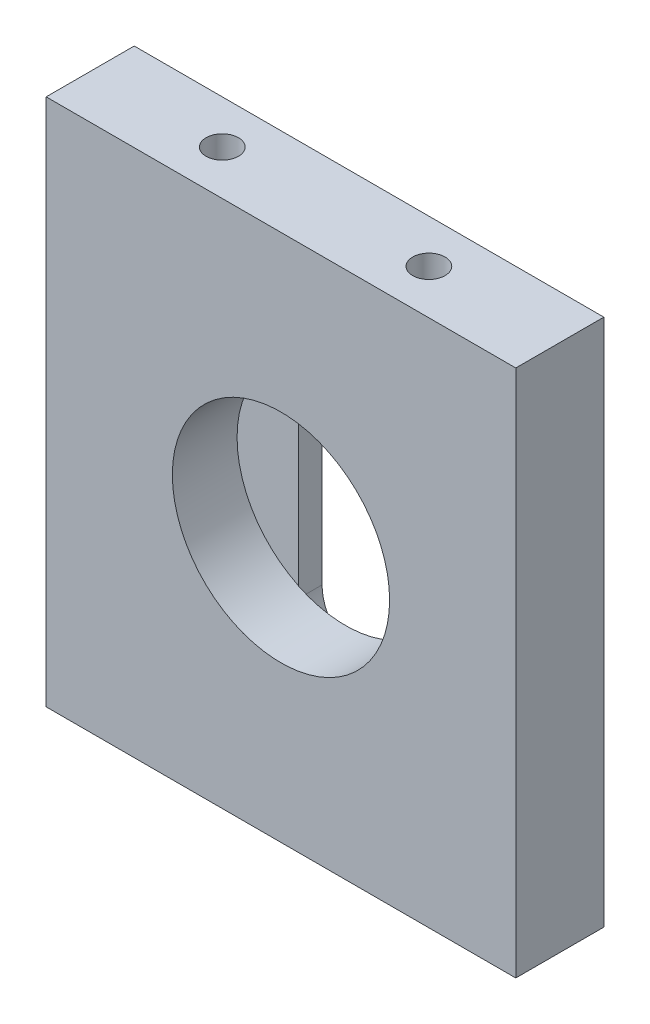
ISO-10303-21;
HEADER;
FILE_DESCRIPTION(('STEP AP214'),'2;1');
FILE_NAME('part.step','',(''),(''),'','','');
FILE_SCHEMA(('AUTOMOTIVE_DESIGN { 1 0 10303 214 1 1 1 1 }'));
ENDSEC;
DATA;
#1=APPLICATION_CONTEXT('core data for automotive mechanical design processes');
#2=APPLICATION_PROTOCOL_DEFINITION('international standard','automotive_design',2000,#1);
#3=PRODUCT_CONTEXT('',#1,'mechanical');
#4=PRODUCT('Part','Part','',(#3));
#5=PRODUCT_RELATED_PRODUCT_CATEGORY('part','',(#4));
#6=PRODUCT_DEFINITION_FORMATION('','',#4);
#7=PRODUCT_DEFINITION_CONTEXT('part definition',#1,'design');
#8=PRODUCT_DEFINITION('design','',#6,#7);
#9=PRODUCT_DEFINITION_SHAPE('','',#8);
#10=(LENGTH_UNIT() NAMED_UNIT(*) SI_UNIT(.MILLI.,.METRE.));
#11=(NAMED_UNIT(*) PLANE_ANGLE_UNIT() SI_UNIT($,.RADIAN.));
#12=(NAMED_UNIT(*) SI_UNIT($,.STERADIAN.) SOLID_ANGLE_UNIT());
#13=UNCERTAINTY_MEASURE_WITH_UNIT(LENGTH_MEASURE(1.E-05),#10,'distance_accuracy_value','');
#14=(GEOMETRIC_REPRESENTATION_CONTEXT(3) GLOBAL_UNCERTAINTY_ASSIGNED_CONTEXT((#13)) GLOBAL_UNIT_ASSIGNED_CONTEXT((#10,
#11,#12)) REPRESENTATION_CONTEXT('',''));
#15=CARTESIAN_POINT('',(0.,0.,0.));
#16=DIRECTION('',(0.,0.,1.));
#17=DIRECTION('',(1.,0.,0.));
#18=AXIS2_PLACEMENT_3D('',#15,#16,#17);
#19=CARTESIAN_POINT('',(-50.8,57.15,5.05000006));
#20=DIRECTION('',(0.,0.,1.));
#21=DIRECTION('',(1.,0.,0.));
#22=AXIS2_PLACEMENT_3D('',#19,#20,#21);
#23=PLANE('',#22);
#24=DIRECTION('',(0.,1.,0.));
#25=VECTOR('',#24,1.);
#26=CARTESIAN_POINT('',(-40.64,57.15,5.05000006));
#27=LINE('',#26,#25);
#28=CARTESIAN_POINT('',(-40.64,35.9597999395944,5.05000006));
#29=VERTEX_POINT('',#28);
#30=CARTESIAN_POINT('',(-40.64,78.3402000604056,5.05000006));
#31=VERTEX_POINT('',#30);
#32=EDGE_CURVE('E1775',#29,#31,#27,.T.);
#33=ORIENTED_EDGE('',*,*,#32,.F.);
#34=CARTESIAN_POINT('',(-50.8,57.15,5.05000006));
#35=DIRECTION('',(0.,0.,1.));
#36=DIRECTION('',(1.,0.,0.));
#37=AXIS2_PLACEMENT_3D('',#34,#35,#36);
#38=CIRCLE('',#37,23.5000038);
#39=EDGE_CURVE('E1689',#29,#31,#38,.T.);
#40=ORIENTED_EDGE('',*,*,#39,.T.);
#41=EDGE_LOOP('',(#33,#40));
#42=FACE_BOUND('',#41,.T.);
#43=ADVANCED_FACE('F1516',(#42),#23,.T.);
#44=CARTESIAN_POINT('',(0.,0.,19.05));
#45=DIRECTION('',(0.,1.,0.));
#46=DIRECTION('',(0.,0.,1.));
#47=AXIS2_PLACEMENT_3D('',#44,#45,#46);
#48=PLANE('',#47);
#49=CARTESIAN_POINT('',(-73.152,0.,9.652));
#50=DIRECTION('',(0.,-1.,0.));
#51=DIRECTION('',(0.,0.,-1.));
#52=AXIS2_PLACEMENT_3D('',#49,#50,#51);
#53=CIRCLE('',#52,3.5);
#54=CARTESIAN_POINT('',(-73.152,0.,6.152));
#55=VERTEX_POINT('',#54);
#56=EDGE_CURVE('E1711',#55,#55,#53,.T.);
#57=ORIENTED_EDGE('',*,*,#56,.F.);
#58=EDGE_LOOP('',(#57));
#59=FACE_BOUND('',#58,.T.);
#60=CARTESIAN_POINT('',(-28.448,0.,9.652));
#61=DIRECTION('',(0.,-1.,0.));
#62=DIRECTION('',(0.,0.,-1.));
#63=AXIS2_PLACEMENT_3D('',#60,#61,#62);
#64=CIRCLE('',#63,3.5);
#65=CARTESIAN_POINT('',(-28.448,0.,6.152));
#66=VERTEX_POINT('',#65);
#67=EDGE_CURVE('E1722',#66,#66,#64,.T.);
#68=ORIENTED_EDGE('',*,*,#67,.F.);
#69=EDGE_LOOP('',(#68));
#70=FACE_BOUND('',#69,.T.);
#71=DIRECTION('',(1.,0.,0.));
#72=VECTOR('',#71,1.);
#73=CARTESIAN_POINT('',(0.,0.,0.));
#74=LINE('',#73,#72);
#75=CARTESIAN_POINT('',(-101.6,0.,0.));
#76=VERTEX_POINT('',#75);
#77=CARTESIAN_POINT('',(0.,0.,0.));
#78=VERTEX_POINT('',#77);
#79=EDGE_CURVE('E1727',#76,#78,#74,.T.);
#80=ORIENTED_EDGE('',*,*,#79,.T.);
#81=DIRECTION('',(0.,0.,-1.));
#82=VECTOR('',#81,1.);
#83=CARTESIAN_POINT('',(0.,0.,19.05));
#84=LINE('',#83,#82);
#85=CARTESIAN_POINT('',(0.,0.,19.05));
#86=VERTEX_POINT('',#85);
#87=EDGE_CURVE('E1770',#86,#78,#84,.T.);
#88=ORIENTED_EDGE('',*,*,#87,.F.);
#89=DIRECTION('',(1.,0.,0.));
#90=VECTOR('',#89,1.);
#91=CARTESIAN_POINT('',(0.,0.,19.05));
#92=LINE('',#91,#90);
#93=CARTESIAN_POINT('',(-101.6,0.,19.05));
#94=VERTEX_POINT('',#93);
#95=EDGE_CURVE('E1729',#94,#86,#92,.T.);
#96=ORIENTED_EDGE('',*,*,#95,.F.);
#97=DIRECTION('',(0.,0.,-1.));
#98=VECTOR('',#97,1.);
#99=CARTESIAN_POINT('',(-101.6,0.,19.05));
#100=LINE('',#99,#98);
#101=EDGE_CURVE('E1744',#94,#76,#100,.T.);
#102=ORIENTED_EDGE('',*,*,#101,.T.);
#103=EDGE_LOOP('',(#80,#88,#96,#102));
#104=FACE_BOUND('',#103,.T.);
#105=ADVANCED_FACE('F1519',(#59,#70,#104),#48,.F.);
#106=CARTESIAN_POINT('',(0.,0.,19.05));
#107=DIRECTION('',(-1.,0.,0.));
#108=DIRECTION('',(0.,0.,1.));
#109=AXIS2_PLACEMENT_3D('',#106,#107,#108);
#110=PLANE('',#109);
#111=DIRECTION('',(0.,1.,0.));
#112=VECTOR('',#111,1.);
#113=CARTESIAN_POINT('',(0.,0.,0.));
#114=LINE('',#113,#112);
#115=CARTESIAN_POINT('',(0.,114.3,0.));
#116=VERTEX_POINT('',#115);
#117=EDGE_CURVE('E1748',#78,#116,#114,.T.);
#118=ORIENTED_EDGE('',*,*,#117,.T.);
#119=DIRECTION('',(0.,0.,-1.));
#120=VECTOR('',#119,1.);
#121=CARTESIAN_POINT('',(0.,114.3,19.05));
#122=LINE('',#121,#120);
#123=CARTESIAN_POINT('',(0.,114.3,19.05));
#124=VERTEX_POINT('',#123);
#125=EDGE_CURVE('E1764',#124,#116,#122,.T.);
#126=ORIENTED_EDGE('',*,*,#125,.F.);
#127=DIRECTION('',(0.,1.,0.));
#128=VECTOR('',#127,1.);
#129=CARTESIAN_POINT('',(0.,0.,19.05));
#130=LINE('',#129,#128);
#131=EDGE_CURVE('E1731',#86,#124,#130,.T.);
#132=ORIENTED_EDGE('',*,*,#131,.F.);
#133=ORIENTED_EDGE('',*,*,#87,.T.);
#134=EDGE_LOOP('',(#118,#126,#132,#133));
#135=FACE_BOUND('',#134,.T.);
#136=ADVANCED_FACE('F1838',(#135),#110,.F.);
#137=CARTESIAN_POINT('',(0.,114.3,19.05));
#138=DIRECTION('',(0.,-1.,0.));
#139=DIRECTION('',(0.,0.,-1.));
#140=AXIS2_PLACEMENT_3D('',#137,#138,#139);
#141=PLANE('',#140);
#142=CARTESIAN_POINT('',(-28.448,114.3,9.398));
#143=DIRECTION('',(0.,1.,0.));
#144=DIRECTION('',(0.,0.,1.));
#145=AXIS2_PLACEMENT_3D('',#142,#143,#144);
#146=CIRCLE('',#145,3.49999999999999);
#147=CARTESIAN_POINT('',(-28.448,114.3,12.898));
#148=VERTEX_POINT('',#147);
#149=EDGE_CURVE('E1700',#148,#148,#146,.T.);
#150=ORIENTED_EDGE('',*,*,#149,.F.);
#151=EDGE_LOOP('',(#150));
#152=FACE_BOUND('',#151,.T.);
#153=CARTESIAN_POINT('',(-73.152,114.3,9.398));
#154=DIRECTION('',(0.,1.,0.));
#155=DIRECTION('',(0.,0.,1.));
#156=AXIS2_PLACEMENT_3D('',#153,#154,#155);
#157=CIRCLE('',#156,3.49999999999999);
#158=CARTESIAN_POINT('',(-73.152,114.3,12.898));
#159=VERTEX_POINT('',#158);
#160=EDGE_CURVE('E1704',#159,#159,#157,.T.);
#161=ORIENTED_EDGE('',*,*,#160,.F.);
#162=EDGE_LOOP('',(#161));
#163=FACE_BOUND('',#162,.T.);
#164=DIRECTION('',(-1.,0.,0.));
#165=VECTOR('',#164,1.);
#166=CARTESIAN_POINT('',(0.,114.3,0.));
#167=LINE('',#166,#165);
#168=CARTESIAN_POINT('',(-101.6,114.3,0.));
#169=VERTEX_POINT('',#168);
#170=EDGE_CURVE('E1751',#116,#169,#167,.T.);
#171=ORIENTED_EDGE('',*,*,#170,.T.);
#172=DIRECTION('',(0.,0.,-1.));
#173=VECTOR('',#172,1.);
#174=CARTESIAN_POINT('',(-101.6,114.3,19.05));
#175=LINE('',#174,#173);
#176=CARTESIAN_POINT('',(-101.6,114.3,19.05));
#177=VERTEX_POINT('',#176);
#178=EDGE_CURVE('E1758',#177,#169,#175,.T.);
#179=ORIENTED_EDGE('',*,*,#178,.F.);
#180=DIRECTION('',(-1.,0.,0.));
#181=VECTOR('',#180,1.);
#182=CARTESIAN_POINT('',(0.,114.3,19.05));
#183=LINE('',#182,#181);
#184=EDGE_CURVE('E1736',#124,#177,#183,.T.);
#185=ORIENTED_EDGE('',*,*,#184,.F.);
#186=ORIENTED_EDGE('',*,*,#125,.T.);
#187=EDGE_LOOP('',(#171,#179,#185,#186));
#188=FACE_BOUND('',#187,.T.);
#189=ADVANCED_FACE('F1865',(#152,#163,#188),#141,.F.);
#190=CARTESIAN_POINT('',(-101.6,0.,19.05));
#191=DIRECTION('',(1.,0.,0.));
#192=DIRECTION('',(0.,0.,-1.));
#193=AXIS2_PLACEMENT_3D('',#190,#191,#192);
#194=PLANE('',#193);
#195=DIRECTION('',(0.,-1.,0.));
#196=VECTOR('',#195,1.);
#197=CARTESIAN_POINT('',(-101.6,0.,0.));
#198=LINE('',#197,#196);
#199=EDGE_CURVE('E1733',#169,#76,#198,.T.);
#200=ORIENTED_EDGE('',*,*,#199,.T.);
#201=ORIENTED_EDGE('',*,*,#101,.F.);
#202=DIRECTION('',(0.,-1.,0.));
#203=VECTOR('',#202,1.);
#204=CARTESIAN_POINT('',(-101.6,0.,19.05));
#205=LINE('',#204,#203);
#206=EDGE_CURVE('E1743',#177,#94,#205,.T.);
#207=ORIENTED_EDGE('',*,*,#206,.F.);
#208=ORIENTED_EDGE('',*,*,#178,.T.);
#209=EDGE_LOOP('',(#200,#201,#207,#208));
#210=FACE_BOUND('',#209,.T.);
#211=ADVANCED_FACE('F1858',(#210),#194,.F.);
#212=CARTESIAN_POINT('',(0.,0.,19.05));
#213=DIRECTION('',(0.,0.,-1.));
#214=DIRECTION('',(-1.,0.,0.));
#215=AXIS2_PLACEMENT_3D('',#212,#213,#214);
#216=PLANE('',#215);
#217=CARTESIAN_POINT('',(-50.8,57.15,19.05));
#218=DIRECTION('',(0.,0.,1.));
#219=DIRECTION('',(1.,0.,0.));
#220=AXIS2_PLACEMENT_3D('',#217,#218,#219);
#221=CIRCLE('',#220,23.5000038);
#222=CARTESIAN_POINT('',(-27.2999962,57.15,19.05));
#223=VERTEX_POINT('',#222);
#224=EDGE_CURVE('E1686',#223,#223,#221,.T.);
#225=ORIENTED_EDGE('',*,*,#224,.F.);
#226=EDGE_LOOP('',(#225));
#227=FACE_BOUND('',#226,.T.);
#228=ORIENTED_EDGE('',*,*,#95,.T.);
#229=ORIENTED_EDGE('',*,*,#131,.T.);
#230=ORIENTED_EDGE('',*,*,#184,.T.);
#231=ORIENTED_EDGE('',*,*,#206,.T.);
#232=EDGE_LOOP('',(#228,#229,#230,#231));
#233=FACE_BOUND('',#232,.T.);
#234=ADVANCED_FACE('F1847',(#227,#233),#216,.F.);
#235=CARTESIAN_POINT('',(0.,0.,0.));
#236=DIRECTION('',(0.,0.,-1.));
#237=DIRECTION('',(-1.,0.,0.));
#238=AXIS2_PLACEMENT_3D('',#235,#236,#237);
#239=PLANE('',#238);
#240=CARTESIAN_POINT('',(-50.8,33.6499962,0.));
#241=DIRECTION('',(0.,0.,-1.));
#242=DIRECTION('',(-1.,0.,0.));
#243=AXIS2_PLACEMENT_3D('',#240,#241,#242);
#244=CIRCLE('',#243,10.16);
#245=CARTESIAN_POINT('',(-40.64,33.6499962,0.));
#246=VERTEX_POINT('',#245);
#247=CARTESIAN_POINT('',(-60.96,33.6499962,0.));
#248=VERTEX_POINT('',#247);
#249=EDGE_CURVE('E1532',#246,#248,#244,.T.);
#250=ORIENTED_EDGE('',*,*,#249,.F.);
#251=DIRECTION('',(0.,-1.,0.));
#252=VECTOR('',#251,1.);
#253=CARTESIAN_POINT('',(-40.64,33.6499962,0.));
#254=LINE('',#253,#252);
#255=CARTESIAN_POINT('',(-40.64,80.6500038,0.));
#256=VERTEX_POINT('',#255);
#257=EDGE_CURVE('E1644',#256,#246,#254,.T.);
#258=ORIENTED_EDGE('',*,*,#257,.F.);
#259=CARTESIAN_POINT('',(-50.8,80.6500038,0.));
#260=DIRECTION('',(0.,0.,-1.));
#261=DIRECTION('',(-1.,0.,0.));
#262=AXIS2_PLACEMENT_3D('',#259,#260,#261);
#263=CIRCLE('',#262,10.16);
#264=CARTESIAN_POINT('',(-60.96,80.6500038,0.));
#265=VERTEX_POINT('',#264);
#266=EDGE_CURVE('E1652',#265,#256,#263,.T.);
#267=ORIENTED_EDGE('',*,*,#266,.F.);
#268=DIRECTION('',(0.,1.,0.));
#269=VECTOR('',#268,1.);
#270=CARTESIAN_POINT('',(-60.96,33.6499962,0.));
#271=LINE('',#270,#269);
#272=EDGE_CURVE('E1664',#248,#265,#271,.T.);
#273=ORIENTED_EDGE('',*,*,#272,.F.);
#274=EDGE_LOOP('',(#250,#258,#267,#273));
#275=FACE_BOUND('',#274,.T.);
#276=ORIENTED_EDGE('',*,*,#79,.F.);
#277=ORIENTED_EDGE('',*,*,#199,.F.);
#278=ORIENTED_EDGE('',*,*,#170,.F.);
#279=ORIENTED_EDGE('',*,*,#117,.F.);
#280=EDGE_LOOP('',(#276,#277,#278,#279));
#281=FACE_BOUND('',#280,.T.);
#282=ADVANCED_FACE('F1841',(#275,#281),#239,.T.);
#283=CARTESIAN_POINT('',(-28.448,19.05,9.652));
#284=DIRECTION('',(0.,-1.,0.));
#285=DIRECTION('',(0.,0.,-1.));
#286=AXIS2_PLACEMENT_3D('',#283,#284,#285);
#287=CONICAL_SURFACE('',#286,3.5,1.02974425867665);
#288=CARTESIAN_POINT('',(-28.448,21.1530121665965,9.652));
#289=VERTEX_POINT('',#288);
#290=VERTEX_LOOP('',#289);
#291=FACE_BOUND('',#290,.T.);
#292=CARTESIAN_POINT('',(-28.448,19.05,9.652));
#293=DIRECTION('',(0.,-1.,0.));
#294=DIRECTION('',(0.,0.,-1.));
#295=AXIS2_PLACEMENT_3D('',#292,#293,#294);
#296=CIRCLE('',#295,3.5);
#297=CARTESIAN_POINT('',(-28.448,19.05,6.152));
#298=VERTEX_POINT('',#297);
#299=EDGE_CURVE('E1723',#298,#298,#296,.T.);
#300=ORIENTED_EDGE('',*,*,#299,.T.);
#301=EDGE_LOOP('',(#300));
#302=FACE_BOUND('',#301,.T.);
#303=ADVANCED_FACE('F1848',(#291,#302),#287,.F.);
#304=CARTESIAN_POINT('',(-28.448,0.,9.652));
#305=DIRECTION('',(0.,-1.,0.));
#306=DIRECTION('',(0.,0.,-1.));
#307=AXIS2_PLACEMENT_3D('',#304,#305,#306);
#308=CYLINDRICAL_SURFACE('',#307,3.5);
#309=ORIENTED_EDGE('',*,*,#299,.F.);
#310=EDGE_LOOP('',(#309));
#311=FACE_BOUND('',#310,.T.);
#312=ORIENTED_EDGE('',*,*,#67,.T.);
#313=EDGE_LOOP('',(#312));
#314=FACE_BOUND('',#313,.T.);
#315=ADVANCED_FACE('F1904',(#311,#314),#308,.F.);
#316=CARTESIAN_POINT('',(-73.152,19.05,9.652));
#317=DIRECTION('',(0.,-1.,0.));
#318=DIRECTION('',(0.,0.,-1.));
#319=AXIS2_PLACEMENT_3D('',#316,#317,#318);
#320=CONICAL_SURFACE('',#319,3.49999999999999,1.02974425867665);
#321=CARTESIAN_POINT('',(-73.152,21.1530121665965,9.652));
#322=VERTEX_POINT('',#321);
#323=VERTEX_LOOP('',#322);
#324=FACE_BOUND('',#323,.T.);
#325=CARTESIAN_POINT('',(-73.152,19.05,9.652));
#326=DIRECTION('',(0.,-1.,0.));
#327=DIRECTION('',(0.,0.,-1.));
#328=AXIS2_PLACEMENT_3D('',#325,#326,#327);
#329=CIRCLE('',#328,3.49999999999999);
#330=CARTESIAN_POINT('',(-73.152,19.05,6.15200000000001));
#331=VERTEX_POINT('',#330);
#332=EDGE_CURVE('E1719',#331,#331,#329,.T.);
#333=ORIENTED_EDGE('',*,*,#332,.T.);
#334=EDGE_LOOP('',(#333));
#335=FACE_BOUND('',#334,.T.);
#336=ADVANCED_FACE('F1914',(#324,#335),#320,.F.);
#337=CARTESIAN_POINT('',(-73.152,0.,9.652));
#338=DIRECTION('',(0.,-1.,0.));
#339=DIRECTION('',(0.,0.,-1.));
#340=AXIS2_PLACEMENT_3D('',#337,#338,#339);
#341=CYLINDRICAL_SURFACE('',#340,3.5);
#342=ORIENTED_EDGE('',*,*,#332,.F.);
#343=EDGE_LOOP('',(#342));
#344=FACE_BOUND('',#343,.T.);
#345=ORIENTED_EDGE('',*,*,#56,.T.);
#346=EDGE_LOOP('',(#345));
#347=FACE_BOUND('',#346,.T.);
#348=ADVANCED_FACE('F1924',(#344,#347),#341,.F.);
#349=CARTESIAN_POINT('',(-73.152,95.25,9.398));
#350=DIRECTION('',(0.,1.,0.));
#351=DIRECTION('',(0.,0.,1.));
#352=AXIS2_PLACEMENT_3D('',#349,#350,#351);
#353=CONICAL_SURFACE('',#352,3.49999999999999,1.02974425867665);
#354=CARTESIAN_POINT('',(-73.152,93.1469878334035,9.398));
#355=VERTEX_POINT('',#354);
#356=VERTEX_LOOP('',#355);
#357=FACE_BOUND('',#356,.T.);
#358=CARTESIAN_POINT('',(-73.152,95.25,9.398));
#359=DIRECTION('',(0.,1.,0.));
#360=DIRECTION('',(0.,0.,1.));
#361=AXIS2_PLACEMENT_3D('',#358,#359,#360);
#362=CIRCLE('',#361,3.49999999999999);
#363=CARTESIAN_POINT('',(-73.152,95.25,12.898));
#364=VERTEX_POINT('',#363);
#365=EDGE_CURVE('E1706',#364,#364,#362,.T.);
#366=ORIENTED_EDGE('',*,*,#365,.T.);
#367=EDGE_LOOP('',(#366));
#368=FACE_BOUND('',#367,.T.);
#369=ADVANCED_FACE('F1937',(#357,#368),#353,.F.);
#370=CARTESIAN_POINT('',(-73.152,114.3,9.398));
#371=DIRECTION('',(0.,1.,0.));
#372=DIRECTION('',(0.,0.,1.));
#373=AXIS2_PLACEMENT_3D('',#370,#371,#372);
#374=CYLINDRICAL_SURFACE('',#373,3.49999999999999);
#375=ORIENTED_EDGE('',*,*,#365,.F.);
#376=EDGE_LOOP('',(#375));
#377=FACE_BOUND('',#376,.T.);
#378=ORIENTED_EDGE('',*,*,#160,.T.);
#379=EDGE_LOOP('',(#378));
#380=FACE_BOUND('',#379,.T.);
#381=ADVANCED_FACE('F1957',(#377,#380),#374,.F.);
#382=CARTESIAN_POINT('',(-28.448,95.25,9.398));
#383=DIRECTION('',(0.,1.,0.));
#384=DIRECTION('',(0.,0.,1.));
#385=AXIS2_PLACEMENT_3D('',#382,#383,#384);
#386=CONICAL_SURFACE('',#385,3.49999999999999,1.02974425867665);
#387=CARTESIAN_POINT('',(-28.448,93.1469878334035,9.398));
#388=VERTEX_POINT('',#387);
#389=VERTEX_LOOP('',#388);
#390=FACE_BOUND('',#389,.T.);
#391=CARTESIAN_POINT('',(-28.448,95.25,9.398));
#392=DIRECTION('',(0.,1.,0.));
#393=DIRECTION('',(0.,0.,1.));
#394=AXIS2_PLACEMENT_3D('',#391,#392,#393);
#395=CIRCLE('',#394,3.49999999999999);
#396=CARTESIAN_POINT('',(-28.448,95.25,12.898));
#397=VERTEX_POINT('',#396);
#398=EDGE_CURVE('E1701',#397,#397,#395,.T.);
#399=ORIENTED_EDGE('',*,*,#398,.T.);
#400=EDGE_LOOP('',(#399));
#401=FACE_BOUND('',#400,.T.);
#402=ADVANCED_FACE('F1970',(#390,#401),#386,.F.);
#403=CARTESIAN_POINT('',(-28.448,114.3,9.398));
#404=DIRECTION('',(0.,1.,0.));
#405=DIRECTION('',(0.,0.,1.));
#406=AXIS2_PLACEMENT_3D('',#403,#404,#405);
#407=CYLINDRICAL_SURFACE('',#406,3.49999999999999);
#408=ORIENTED_EDGE('',*,*,#398,.F.);
#409=EDGE_LOOP('',(#408));
#410=FACE_BOUND('',#409,.T.);
#411=ORIENTED_EDGE('',*,*,#149,.T.);
#412=EDGE_LOOP('',(#411));
#413=FACE_BOUND('',#412,.T.);
#414=ADVANCED_FACE('F1827',(#410,#413),#407,.F.);
#415=CARTESIAN_POINT('',(-50.8,57.15,5.05000006));
#416=DIRECTION('',(0.,0.,1.));
#417=DIRECTION('',(1.,0.,0.));
#418=AXIS2_PLACEMENT_3D('',#415,#416,#417);
#419=CYLINDRICAL_SURFACE('',#418,23.5000038);
#420=ORIENTED_EDGE('',*,*,#39,.F.);
#421=DIRECTION('',(0.,0.,1.));
#422=VECTOR('',#421,1.);
#423=CARTESIAN_POINT('',(-40.64,35.9597999395944,5.05000006));
#424=LINE('',#423,#422);
#425=CARTESIAN_POINT('',(-40.64,35.9597999395944,5.07999999999999));
#426=VERTEX_POINT('',#425);
#427=EDGE_CURVE('E1678',#29,#426,#424,.T.);
#428=ORIENTED_EDGE('',*,*,#427,.T.);
#429=CARTESIAN_POINT('',(-50.8,57.15,5.07999999999999));
#430=DIRECTION('',(0.,0.,-1.));
#431=DIRECTION('',(-1.,0.,0.));
#432=AXIS2_PLACEMENT_3D('',#429,#430,#431);
#433=CIRCLE('',#432,23.5000038);
#434=CARTESIAN_POINT('',(-60.96,35.9597999395944,5.07999999999999));
#435=VERTEX_POINT('',#434);
#436=EDGE_CURVE('E12',#435,#426,#433,.F.);
#437=ORIENTED_EDGE('',*,*,#436,.F.);
#438=DIRECTION('',(0.,0.,1.));
#439=VECTOR('',#438,1.);
#440=CARTESIAN_POINT('',(-60.96,35.9597999395944,5.05000006));
#441=LINE('',#440,#439);
#442=CARTESIAN_POINT('',(-60.96,35.9597999395944,5.05000006));
#443=VERTEX_POINT('',#442);
#444=EDGE_CURVE('E1631',#435,#443,#441,.F.);
#445=ORIENTED_EDGE('',*,*,#444,.T.);
#446=CARTESIAN_POINT('',(-60.96,78.3402000604056,5.05000006));
#447=VERTEX_POINT('',#446);
#448=EDGE_CURVE('E1693',#447,#443,#38,.T.);
#449=ORIENTED_EDGE('',*,*,#448,.F.);
#450=DIRECTION('',(0.,0.,1.));
#451=VECTOR('',#450,1.);
#452=CARTESIAN_POINT('',(-60.96,78.3402000604056,5.05000006));
#453=LINE('',#452,#451);
#454=CARTESIAN_POINT('',(-60.96,78.3402000604056,5.07999999999999));
#455=VERTEX_POINT('',#454);
#456=EDGE_CURVE('E1545',#447,#455,#453,.T.);
#457=ORIENTED_EDGE('',*,*,#456,.T.);
#458=CARTESIAN_POINT('',(-40.64,78.3402000604056,5.07999999999999));
#459=VERTEX_POINT('',#458);
#460=EDGE_CURVE('E1525',#459,#455,#433,.F.);
#461=ORIENTED_EDGE('',*,*,#460,.F.);
#462=DIRECTION('',(0.,0.,1.));
#463=VECTOR('',#462,1.);
#464=CARTESIAN_POINT('',(-40.64,78.3402000604056,5.05000006));
#465=LINE('',#464,#463);
#466=EDGE_CURVE('E1685',#459,#31,#465,.F.);
#467=ORIENTED_EDGE('',*,*,#466,.T.);
#468=EDGE_LOOP('',(#420,#428,#437,#445,#449,#457,#461,#467));
#469=FACE_BOUND('',#468,.T.);
#470=ORIENTED_EDGE('',*,*,#224,.T.);
#471=EDGE_LOOP('',(#470));
#472=FACE_BOUND('',#471,.T.);
#473=ADVANCED_FACE('F1786',(#469,#472),#419,.F.);
#474=DIRECTION('',(0.,-1.,0.));
#475=VECTOR('',#474,1.);
#476=CARTESIAN_POINT('',(-60.96,57.15,5.05000006));
#477=LINE('',#476,#475);
#478=EDGE_CURVE('E1772',#447,#443,#477,.T.);
#479=ORIENTED_EDGE('',*,*,#478,.F.);
#480=ORIENTED_EDGE('',*,*,#448,.T.);
#481=EDGE_LOOP('',(#479,#480));
#482=FACE_BOUND('',#481,.T.);
#483=ADVANCED_FACE('F1819',(#482),#23,.T.);
#484=CARTESIAN_POINT('',(-50.8,33.6499962,5.07999999999999));
#485=DIRECTION('',(0.,0.,-1.));
#486=DIRECTION('',(-1.,0.,0.));
#487=AXIS2_PLACEMENT_3D('',#484,#485,#486);
#488=PLANE('',#487);
#489=ORIENTED_EDGE('',*,*,#436,.T.);
#490=DIRECTION('',(0.,-1.,0.));
#491=VECTOR('',#490,1.);
#492=CARTESIAN_POINT('',(-40.64,33.6499962,5.07999999999999));
#493=LINE('',#492,#491);
#494=CARTESIAN_POINT('',(-40.64,33.6499962,5.07999999999999));
#495=VERTEX_POINT('',#494);
#496=EDGE_CURVE('E1645',#426,#495,#493,.T.);
#497=ORIENTED_EDGE('',*,*,#496,.T.);
#498=CARTESIAN_POINT('',(-50.8,33.6499962,5.07999999999999));
#499=DIRECTION('',(0.,0.,-1.));
#500=DIRECTION('',(-1.,0.,0.));
#501=AXIS2_PLACEMENT_3D('',#498,#499,#500);
#502=CIRCLE('',#501,10.16);
#503=CARTESIAN_POINT('',(-60.96,33.6499962,5.07999999999999));
#504=VERTEX_POINT('',#503);
#505=EDGE_CURVE('E1624',#495,#504,#502,.T.);
#506=ORIENTED_EDGE('',*,*,#505,.T.);
#507=DIRECTION('',(0.,1.,0.));
#508=VECTOR('',#507,1.);
#509=CARTESIAN_POINT('',(-60.96,33.6499962,5.07999999999999));
#510=LINE('',#509,#508);
#511=EDGE_CURVE('E1629',#504,#435,#510,.T.);
#512=ORIENTED_EDGE('',*,*,#511,.T.);
#513=EDGE_LOOP('',(#489,#497,#506,#512));
#514=FACE_BOUND('',#513,.T.);
#515=ADVANCED_FACE('F1639',(#514),#488,.T.);
#516=ORIENTED_EDGE('',*,*,#460,.T.);
#517=CARTESIAN_POINT('',(-60.96,80.6500038,5.07999999999999));
#518=VERTEX_POINT('',#517);
#519=EDGE_CURVE('E1638',#455,#518,#510,.T.);
#520=ORIENTED_EDGE('',*,*,#519,.T.);
#521=CARTESIAN_POINT('',(-50.8,80.6500038,5.07999999999999));
#522=DIRECTION('',(0.,0.,-1.));
#523=DIRECTION('',(-1.,0.,0.));
#524=AXIS2_PLACEMENT_3D('',#521,#522,#523);
#525=CIRCLE('',#524,10.16);
#526=CARTESIAN_POINT('',(-40.64,80.6500038,5.07999999999999));
#527=VERTEX_POINT('',#526);
#528=EDGE_CURVE('E1640',#518,#527,#525,.T.);
#529=ORIENTED_EDGE('',*,*,#528,.T.);
#530=EDGE_CURVE('E1627',#527,#459,#493,.T.);
#531=ORIENTED_EDGE('',*,*,#530,.T.);
#532=EDGE_LOOP('',(#516,#520,#529,#531));
#533=FACE_BOUND('',#532,.T.);
#534=ADVANCED_FACE('F1785',(#533),#488,.T.);
#535=CARTESIAN_POINT('',(-40.64,33.6499962,5.07999999999999));
#536=DIRECTION('',(1.,0.,0.));
#537=DIRECTION('',(0.,1.,0.));
#538=AXIS2_PLACEMENT_3D('',#535,#536,#537);
#539=PLANE('',#538);
#540=ORIENTED_EDGE('',*,*,#530,.F.);
#541=DIRECTION('',(0.,0.,-1.));
#542=VECTOR('',#541,1.);
#543=CARTESIAN_POINT('',(-40.64,80.6500038,5.07999999999999));
#544=LINE('',#543,#542);
#545=EDGE_CURVE('E1673',#527,#256,#544,.T.);
#546=ORIENTED_EDGE('',*,*,#545,.T.);
#547=ORIENTED_EDGE('',*,*,#257,.T.);
#548=DIRECTION('',(0.,0.,-1.));
#549=VECTOR('',#548,1.);
#550=CARTESIAN_POINT('',(-40.64,33.6499962,5.07999999999999));
#551=LINE('',#550,#549);
#552=EDGE_CURVE('E1666',#495,#246,#551,.T.);
#553=ORIENTED_EDGE('',*,*,#552,.F.);
#554=ORIENTED_EDGE('',*,*,#496,.F.);
#555=ORIENTED_EDGE('',*,*,#427,.F.);
#556=ORIENTED_EDGE('',*,*,#32,.T.);
#557=ORIENTED_EDGE('',*,*,#466,.F.);
#558=EDGE_LOOP('',(#540,#546,#547,#553,#554,#555,#556,#557));
#559=FACE_BOUND('',#558,.T.);
#560=ADVANCED_FACE('F1836',(#559),#539,.F.);
#561=CARTESIAN_POINT('',(-60.96,33.6499962,5.07999999999999));
#562=DIRECTION('',(-1.,0.,0.));
#563=DIRECTION('',(0.,0.,1.));
#564=AXIS2_PLACEMENT_3D('',#561,#562,#563);
#565=PLANE('',#564);
#566=ORIENTED_EDGE('',*,*,#511,.F.);
#567=DIRECTION('',(0.,0.,-1.));
#568=VECTOR('',#567,1.);
#569=CARTESIAN_POINT('',(-60.96,33.6499962,5.07999999999999));
#570=LINE('',#569,#568);
#571=EDGE_CURVE('E1616',#504,#248,#570,.T.);
#572=ORIENTED_EDGE('',*,*,#571,.T.);
#573=ORIENTED_EDGE('',*,*,#272,.T.);
#574=DIRECTION('',(0.,0.,-1.));
#575=VECTOR('',#574,1.);
#576=CARTESIAN_POINT('',(-60.96,80.6500038,5.07999999999999));
#577=LINE('',#576,#575);
#578=EDGE_CURVE('E1628',#518,#265,#577,.T.);
#579=ORIENTED_EDGE('',*,*,#578,.F.);
#580=ORIENTED_EDGE('',*,*,#519,.F.);
#581=ORIENTED_EDGE('',*,*,#456,.F.);
#582=ORIENTED_EDGE('',*,*,#478,.T.);
#583=ORIENTED_EDGE('',*,*,#444,.F.);
#584=EDGE_LOOP('',(#566,#572,#573,#579,#580,#581,#582,#583));
#585=FACE_BOUND('',#584,.T.);
#586=ADVANCED_FACE('F1633',(#585),#565,.F.);
#587=CARTESIAN_POINT('',(-50.8,33.6499962,5.07999999999999));
#588=DIRECTION('',(0.,0.,-1.));
#589=DIRECTION('',(-1.,0.,0.));
#590=AXIS2_PLACEMENT_3D('',#587,#588,#589);
#591=CYLINDRICAL_SURFACE('',#590,10.16);
#592=ORIENTED_EDGE('',*,*,#249,.T.);
#593=ORIENTED_EDGE('',*,*,#571,.F.);
#594=ORIENTED_EDGE('',*,*,#505,.F.);
#595=ORIENTED_EDGE('',*,*,#552,.T.);
#596=EDGE_LOOP('',(#592,#593,#594,#595));
#597=FACE_BOUND('',#596,.T.);
#598=ADVANCED_FACE('F1619',(#597),#591,.F.);
#599=CARTESIAN_POINT('',(-50.8,80.6500038,5.07999999999999));
#600=DIRECTION('',(0.,0.,-1.));
#601=DIRECTION('',(-1.,0.,0.));
#602=AXIS2_PLACEMENT_3D('',#599,#600,#601);
#603=CYLINDRICAL_SURFACE('',#602,10.16);
#604=ORIENTED_EDGE('',*,*,#266,.T.);
#605=ORIENTED_EDGE('',*,*,#545,.F.);
#606=ORIENTED_EDGE('',*,*,#528,.F.);
#607=ORIENTED_EDGE('',*,*,#578,.T.);
#608=EDGE_LOOP('',(#604,#605,#606,#607));
#609=FACE_BOUND('',#608,.T.);
#610=ADVANCED_FACE('F1844',(#609),#603,.F.);
#611=CLOSED_SHELL('',(#43,#105,#136,#189,#211,#234,#282,#303,#315,#336,#348,#369,#381,#402,#414,
#473,#483,#515,#534,#560,#586,#598,#610));
#612=MANIFOLD_SOLID_BREP('B2',#611);
#613=ADVANCED_BREP_SHAPE_REPRESENTATION('',(#18,#612),#14);
#614=SHAPE_DEFINITION_REPRESENTATION(#9,#613);
ENDSEC;
END-ISO-10303-21;
